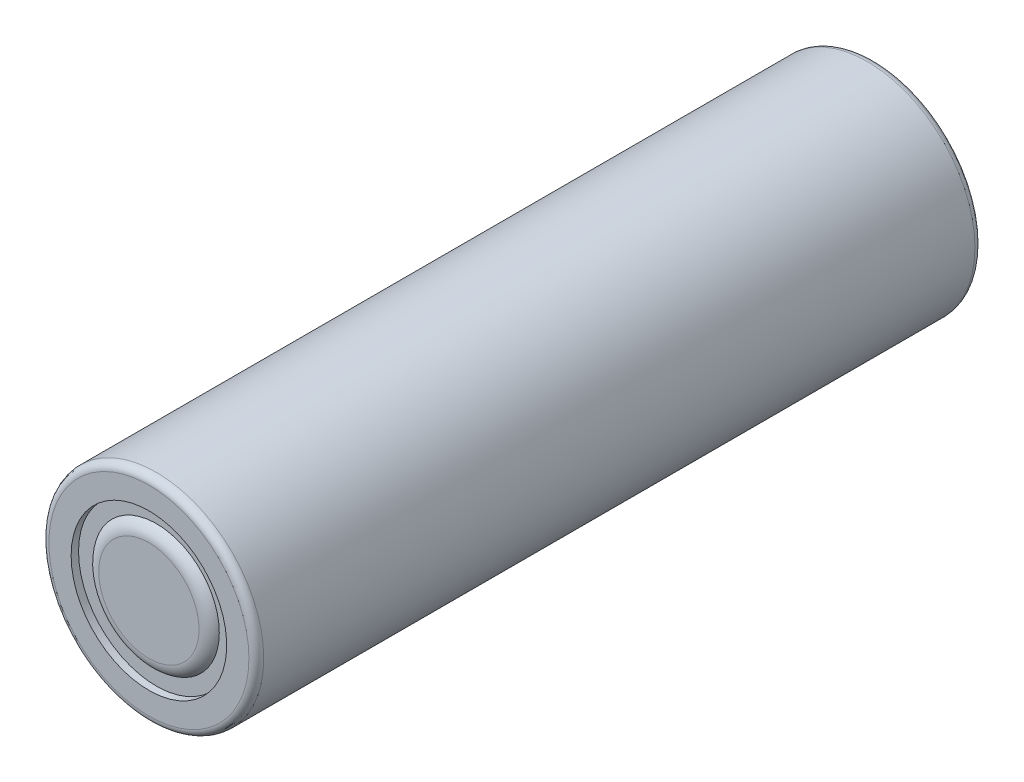
ISO-10303-21;
HEADER;
FILE_DESCRIPTION(('STEP AP214'),'2;1');
FILE_NAME('part.step','',(''),(''),'','','');
FILE_SCHEMA(('AUTOMOTIVE_DESIGN { 1 0 10303 214 1 1 1 1 }'));
ENDSEC;
DATA;
#1=APPLICATION_CONTEXT('core data for automotive mechanical design processes');
#2=APPLICATION_PROTOCOL_DEFINITION('international standard','automotive_design',2000,#1);
#3=PRODUCT_CONTEXT('',#1,'mechanical');
#4=PRODUCT('Part','Part','',(#3));
#5=PRODUCT_RELATED_PRODUCT_CATEGORY('part','',(#4));
#6=PRODUCT_DEFINITION_FORMATION('','',#4);
#7=PRODUCT_DEFINITION_CONTEXT('part definition',#1,'design');
#8=PRODUCT_DEFINITION('design','',#6,#7);
#9=PRODUCT_DEFINITION_SHAPE('','',#8);
#10=(LENGTH_UNIT() NAMED_UNIT(*) SI_UNIT(.MILLI.,.METRE.));
#11=(NAMED_UNIT(*) PLANE_ANGLE_UNIT() SI_UNIT($,.RADIAN.));
#12=(NAMED_UNIT(*) SI_UNIT($,.STERADIAN.) SOLID_ANGLE_UNIT());
#13=UNCERTAINTY_MEASURE_WITH_UNIT(LENGTH_MEASURE(1.E-05),#10,'distance_accuracy_value','');
#14=(GEOMETRIC_REPRESENTATION_CONTEXT(3) GLOBAL_UNCERTAINTY_ASSIGNED_CONTEXT((#13)) GLOBAL_UNIT_ASSIGNED_CONTEXT((#10,
#11,#12)) REPRESENTATION_CONTEXT('',''));
#15=CARTESIAN_POINT('',(0.,0.,0.));
#16=DIRECTION('',(0.,0.,1.));
#17=DIRECTION('',(1.,0.,0.));
#18=AXIS2_PLACEMENT_3D('',#15,#16,#17);
#19=CARTESIAN_POINT('',(0.,0.,-1.5));
#20=DIRECTION('',(0.,0.,1.));
#21=DIRECTION('',(1.,0.,0.));
#22=AXIS2_PLACEMENT_3D('',#19,#20,#21);
#23=PLANE('',#22);
#24=CARTESIAN_POINT('',(0.,0.,-1.5));
#25=DIRECTION('',(0.,0.,1.));
#26=DIRECTION('',(-1.,0.,0.));
#27=AXIS2_PLACEMENT_3D('',#24,#25,#26);
#28=CIRCLE('',#27,2.25);
#29=CARTESIAN_POINT('',(-2.25,0.,-1.5));
#30=VERTEX_POINT('',#29);
#31=EDGE_CURVE('E197',#30,#30,#28,.T.);
#32=ORIENTED_EDGE('',*,*,#31,.F.);
#33=EDGE_LOOP('',(#32));
#34=FACE_BOUND('',#33,.T.);
#35=ADVANCED_FACE('F13',(#34),#23,.F.);
#36=CARTESIAN_POINT('',(0.,0.,-1.));
#37=DIRECTION('',(0.,0.,-1.));
#38=DIRECTION('',(-1.,0.,0.));
#39=AXIS2_PLACEMENT_3D('',#36,#37,#38);
#40=TOROIDAL_SURFACE('',#39,2.25,0.5);
#41=ORIENTED_EDGE('',*,*,#31,.T.);
#42=EDGE_LOOP('',(#41));
#43=FACE_BOUND('',#42,.T.);
#44=CARTESIAN_POINT('',(0.,0.,-1.));
#45=DIRECTION('',(0.,0.,-1.));
#46=DIRECTION('',(-1.,0.,0.));
#47=AXIS2_PLACEMENT_3D('',#44,#45,#46);
#48=CIRCLE('',#47,2.75);
#49=CARTESIAN_POINT('',(-2.75,0.,-1.));
#50=VERTEX_POINT('',#49);
#51=EDGE_CURVE('E189',#50,#50,#48,.F.);
#52=ORIENTED_EDGE('',*,*,#51,.F.);
#53=EDGE_LOOP('',(#52));
#54=FACE_BOUND('',#53,.T.);
#55=ADVANCED_FACE('F204',(#43,#54),#40,.T.);
#56=CARTESIAN_POINT('',(0.,0.,0.));
#57=DIRECTION('',(0.,0.,-1.));
#58=DIRECTION('',(-1.,0.,0.));
#59=AXIS2_PLACEMENT_3D('',#56,#57,#58);
#60=CYLINDRICAL_SURFACE('',#59,2.75);
#61=CARTESIAN_POINT('',(0.,0.,-0.5));
#62=DIRECTION('',(0.,0.,1.));
#63=DIRECTION('',(1.,0.,0.));
#64=AXIS2_PLACEMENT_3D('',#61,#62,#63);
#65=CIRCLE('',#64,2.75);
#66=CARTESIAN_POINT('',(2.75,0.,-0.5));
#67=VERTEX_POINT('',#66);
#68=EDGE_CURVE('E176',#67,#67,#65,.F.);
#69=ORIENTED_EDGE('',*,*,#68,.T.);
#70=EDGE_LOOP('',(#69));
#71=FACE_BOUND('',#70,.T.);
#72=ORIENTED_EDGE('',*,*,#51,.T.);
#73=EDGE_LOOP('',(#72));
#74=FACE_BOUND('',#73,.T.);
#75=ADVANCED_FACE('F182',(#71,#74),#60,.T.);
#76=CARTESIAN_POINT('',(0.,0.,-0.5));
#77=DIRECTION('',(0.,0.,1.));
#78=DIRECTION('',(1.,0.,0.));
#79=AXIS2_PLACEMENT_3D('',#76,#77,#78);
#80=TOROIDAL_SURFACE('',#79,3.25,0.5);
#81=CARTESIAN_POINT('',(0.,0.,0.));
#82=DIRECTION('',(0.,0.,-1.));
#83=DIRECTION('',(-1.,0.,0.));
#84=AXIS2_PLACEMENT_3D('',#81,#82,#83);
#85=CIRCLE('',#84,3.25);
#86=CARTESIAN_POINT('',(-3.25,0.,0.));
#87=VERTEX_POINT('',#86);
#88=EDGE_CURVE('E165',#87,#87,#85,.T.);
#89=ORIENTED_EDGE('',*,*,#88,.T.);
#90=EDGE_LOOP('',(#89));
#91=FACE_BOUND('',#90,.T.);
#92=ORIENTED_EDGE('',*,*,#68,.F.);
#93=EDGE_LOOP('',(#92));
#94=FACE_BOUND('',#93,.T.);
#95=ADVANCED_FACE('F178',(#91,#94),#80,.F.);
#96=CARTESIAN_POINT('',(0.,0.,0.));
#97=DIRECTION('',(0.,0.,1.));
#98=DIRECTION('',(1.,0.,0.));
#99=AXIS2_PLACEMENT_3D('',#96,#97,#98);
#100=PLANE('',#99);
#101=ORIENTED_EDGE('',*,*,#88,.F.);
#102=EDGE_LOOP('',(#101));
#103=FACE_BOUND('',#102,.T.);
#104=CARTESIAN_POINT('',(0.,0.,0.));
#105=DIRECTION('',(0.,0.,1.));
#106=DIRECTION('',(1.,0.,0.));
#107=AXIS2_PLACEMENT_3D('',#104,#105,#106);
#108=CIRCLE('',#107,3.71598300562505);
#109=CARTESIAN_POINT('',(3.71598300562505,0.,0.));
#110=VERTEX_POINT('',#109);
#111=EDGE_CURVE('E17',#110,#110,#108,.T.);
#112=ORIENTED_EDGE('',*,*,#111,.F.);
#113=EDGE_LOOP('',(#112));
#114=FACE_BOUND('',#113,.T.);
#115=ADVANCED_FACE('F153',(#103,#114),#100,.F.);
#116=CARTESIAN_POINT('',(0.,0.,0.));
#117=DIRECTION('',(0.,0.,1.));
#118=DIRECTION('',(1.,0.,0.));
#119=AXIS2_PLACEMENT_3D('',#116,#117,#118);
#120=TOROIDAL_SURFACE('',#119,3.84098300562505,0.125);
#121=CARTESIAN_POINT('',(0.,0.,0.));
#122=DIRECTION('',(0.,0.,1.));
#123=DIRECTION('',(1.,0.,0.));
#124=AXIS2_PLACEMENT_3D('',#121,#122,#123);
#125=CIRCLE('',#124,3.96598300562505);
#126=CARTESIAN_POINT('',(3.96598300562505,0.,0.));
#127=VERTEX_POINT('',#126);
#128=EDGE_CURVE('E229',#127,#127,#125,.F.);
#129=ORIENTED_EDGE('',*,*,#128,.T.);
#130=EDGE_LOOP('',(#129));
#131=FACE_BOUND('',#130,.T.);
#132=ORIENTED_EDGE('',*,*,#111,.T.);
#133=EDGE_LOOP('',(#132));
#134=FACE_BOUND('',#133,.T.);
#135=ADVANCED_FACE('F148',(#131,#134),#120,.T.);
#136=CARTESIAN_POINT('',(0.,0.,49.));
#137=DIRECTION('',(0.,0.,1.));
#138=DIRECTION('',(1.,0.,0.));
#139=AXIS2_PLACEMENT_3D('',#136,#137,#138);
#140=PLANE('',#139);
#141=CARTESIAN_POINT('',(0.,0.,49.));
#142=DIRECTION('',(0.,0.,-1.));
#143=DIRECTION('',(0.,1.,0.));
#144=AXIS2_PLACEMENT_3D('',#141,#142,#143);
#145=CIRCLE('',#144,3.38397459621556);
#146=CARTESIAN_POINT('',(0.,3.38397459621556,49.));
#147=VERTEX_POINT('',#146);
#148=EDGE_CURVE('E132',#147,#147,#145,.T.);
#149=ORIENTED_EDGE('',*,*,#148,.F.);
#150=EDGE_LOOP('',(#149));
#151=FACE_BOUND('',#150,.T.);
#152=ADVANCED_FACE('F138',(#151),#140,.T.);
#153=CARTESIAN_POINT('',(0.,0.,0.));
#154=DIRECTION('',(0.,0.,1.));
#155=DIRECTION('',(1.,0.,0.));
#156=AXIS2_PLACEMENT_3D('',#153,#154,#155);
#157=PLANE('',#156);
#158=ORIENTED_EDGE('',*,*,#128,.F.);
#159=EDGE_LOOP('',(#158));
#160=FACE_BOUND('',#159,.T.);
#161=CARTESIAN_POINT('',(0.,0.,0.));
#162=DIRECTION('',(0.,0.,1.));
#163=DIRECTION('',(-1.,0.,0.));
#164=AXIS2_PLACEMENT_3D('',#161,#162,#163);
#165=CIRCLE('',#164,4.44098300562505);
#166=CARTESIAN_POINT('',(-4.44098300562505,0.,0.));
#167=VERTEX_POINT('',#166);
#168=EDGE_CURVE('E228',#167,#167,#165,.T.);
#169=ORIENTED_EDGE('',*,*,#168,.F.);
#170=EDGE_LOOP('',(#169));
#171=FACE_BOUND('',#170,.T.);
#172=ADVANCED_FACE('F147',(#160,#171),#157,.F.);
#173=CARTESIAN_POINT('',(0.,0.,48.));
#174=DIRECTION('',(0.,0.,1.));
#175=DIRECTION('',(0.,-1.,0.));
#176=AXIS2_PLACEMENT_3D('',#173,#174,#175);
#177=TOROIDAL_SURFACE('',#176,3.38397459621556,1.);
#178=ORIENTED_EDGE('',*,*,#148,.T.);
#179=EDGE_LOOP('',(#178));
#180=FACE_BOUND('',#179,.T.);
#181=CARTESIAN_POINT('',(0.,0.,48.5));
#182=DIRECTION('',(0.,0.,1.));
#183=DIRECTION('',(1.,0.,0.));
#184=AXIS2_PLACEMENT_3D('',#181,#182,#183);
#185=CIRCLE('',#184,4.25);
#186=CARTESIAN_POINT('',(4.25,0.,48.5));
#187=VERTEX_POINT('',#186);
#188=EDGE_CURVE('E101',#187,#187,#185,.T.);
#189=ORIENTED_EDGE('',*,*,#188,.T.);
#190=EDGE_LOOP('',(#189));
#191=FACE_BOUND('',#190,.T.);
#192=ADVANCED_FACE('F112',(#180,#191),#177,.T.);
#193=CARTESIAN_POINT('',(0.,0.,0.5));
#194=DIRECTION('',(0.,0.,-1.));
#195=DIRECTION('',(-1.,0.,0.));
#196=AXIS2_PLACEMENT_3D('',#193,#194,#195);
#197=TOROIDAL_SURFACE('',#196,4.44098300562505,0.5);
#198=ORIENTED_EDGE('',*,*,#168,.T.);
#199=EDGE_LOOP('',(#198));
#200=FACE_BOUND('',#199,.T.);
#201=CARTESIAN_POINT('',(0.,0.,0.166666666666668));
#202=DIRECTION('',(0.,0.,1.));
#203=DIRECTION('',(1.,0.,0.));
#204=AXIS2_PLACEMENT_3D('',#201,#202,#203);
#205=CIRCLE('',#204,4.81366100187502);
#206=CARTESIAN_POINT('',(4.81366100187502,0.,0.166666666666668));
#207=VERTEX_POINT('',#206);
#208=EDGE_CURVE('E97',#207,#207,#205,.F.);
#209=ORIENTED_EDGE('',*,*,#208,.T.);
#210=EDGE_LOOP('',(#209));
#211=FACE_BOUND('',#210,.T.);
#212=ADVANCED_FACE('F108',(#200,#211),#197,.T.);
#213=CARTESIAN_POINT('',(0.,-4.25,48.5));
#214=DIRECTION('',(0.,0.,-1.));
#215=DIRECTION('',(-1.,0.,0.));
#216=AXIS2_PLACEMENT_3D('',#213,#214,#215);
#217=PLANE('',#216);
#218=ORIENTED_EDGE('',*,*,#188,.F.);
#219=EDGE_LOOP('',(#218));
#220=FACE_BOUND('',#219,.T.);
#221=CARTESIAN_POINT('',(0.,0.,48.5));
#222=DIRECTION('',(0.,0.,-1.));
#223=DIRECTION('',(-1.,0.,0.));
#224=AXIS2_PLACEMENT_3D('',#221,#222,#223);
#225=CIRCLE('',#224,5.25);
#226=CARTESIAN_POINT('',(-5.25,0.,48.5));
#227=VERTEX_POINT('',#226);
#228=EDGE_CURVE('E100',#227,#227,#225,.F.);
#229=ORIENTED_EDGE('',*,*,#228,.T.);
#230=EDGE_LOOP('',(#229));
#231=FACE_BOUND('',#230,.T.);
#232=ADVANCED_FACE('F90',(#220,#231),#217,.F.);
#233=CARTESIAN_POINT('',(0.,0.,0.));
#234=DIRECTION('',(0.,0.,1.));
#235=DIRECTION('',(1.,0.,0.));
#236=AXIS2_PLACEMENT_3D('',#233,#234,#235);
#237=TOROIDAL_SURFACE('',#236,5.,0.25);
#238=ORIENTED_EDGE('',*,*,#208,.F.);
#239=EDGE_LOOP('',(#238));
#240=FACE_BOUND('',#239,.T.);
#241=CARTESIAN_POINT('',(0.,0.,0.));
#242=DIRECTION('',(0.,0.,1.));
#243=DIRECTION('',(1.,0.,0.));
#244=AXIS2_PLACEMENT_3D('',#241,#242,#243);
#245=CIRCLE('',#244,5.25);
#246=CARTESIAN_POINT('',(5.25,0.,0.));
#247=VERTEX_POINT('',#246);
#248=EDGE_CURVE('E222',#247,#247,#245,.F.);
#249=ORIENTED_EDGE('',*,*,#248,.T.);
#250=EDGE_LOOP('',(#249));
#251=FACE_BOUND('',#250,.T.);
#252=ADVANCED_FACE('F85',(#240,#251),#237,.F.);
#253=CARTESIAN_POINT('',(0.,0.,48.75));
#254=DIRECTION('',(0.,0.,-1.));
#255=DIRECTION('',(-1.,0.,0.));
#256=AXIS2_PLACEMENT_3D('',#253,#254,#255);
#257=CYLINDRICAL_SURFACE('',#256,5.25);
#258=CARTESIAN_POINT('',(0.,0.,49.));
#259=DIRECTION('',(0.,0.,-1.));
#260=DIRECTION('',(-1.,0.,0.));
#261=AXIS2_PLACEMENT_3D('',#258,#259,#260);
#262=CIRCLE('',#261,5.25);
#263=CARTESIAN_POINT('',(-5.25,0.,49.));
#264=VERTEX_POINT('',#263);
#265=EDGE_CURVE('E214',#264,#264,#262,.T.);
#266=ORIENTED_EDGE('',*,*,#265,.F.);
#267=EDGE_LOOP('',(#266));
#268=FACE_BOUND('',#267,.T.);
#269=ORIENTED_EDGE('',*,*,#228,.F.);
#270=EDGE_LOOP('',(#269));
#271=FACE_BOUND('',#270,.T.);
#272=ADVANCED_FACE('F80',(#268,#271),#257,.F.);
#273=CARTESIAN_POINT('',(0.,0.,0.));
#274=DIRECTION('',(0.,0.,1.));
#275=DIRECTION('',(1.,0.,0.));
#276=AXIS2_PLACEMENT_3D('',#273,#274,#275);
#277=PLANE('',#276);
#278=ORIENTED_EDGE('',*,*,#248,.F.);
#279=EDGE_LOOP('',(#278));
#280=FACE_BOUND('',#279,.T.);
#281=CARTESIAN_POINT('',(0.,0.,0.));
#282=DIRECTION('',(0.,0.,1.));
#283=DIRECTION('',(1.,0.,0.));
#284=AXIS2_PLACEMENT_3D('',#281,#282,#283);
#285=CIRCLE('',#284,6.75);
#286=CARTESIAN_POINT('',(6.75,0.,0.));
#287=VERTEX_POINT('',#286);
#288=EDGE_CURVE('E64',#287,#287,#285,.T.);
#289=ORIENTED_EDGE('',*,*,#288,.F.);
#290=EDGE_LOOP('',(#289));
#291=FACE_BOUND('',#290,.T.);
#292=ADVANCED_FACE('F70',(#280,#291),#277,.F.);
#293=CARTESIAN_POINT('',(0.,0.,49.));
#294=DIRECTION('',(0.,0.,1.));
#295=DIRECTION('',(1.,0.,0.));
#296=AXIS2_PLACEMENT_3D('',#293,#294,#295);
#297=PLANE('',#296);
#298=ORIENTED_EDGE('',*,*,#265,.T.);
#299=EDGE_LOOP('',(#298));
#300=FACE_BOUND('',#299,.T.);
#301=CARTESIAN_POINT('',(0.,0.,49.));
#302=DIRECTION('',(0.,0.,-1.));
#303=DIRECTION('',(1.,0.,0.));
#304=AXIS2_PLACEMENT_3D('',#301,#302,#303);
#305=CIRCLE('',#304,6.75);
#306=CARTESIAN_POINT('',(6.75,0.,49.));
#307=VERTEX_POINT('',#306);
#308=EDGE_CURVE('E26',#307,#307,#305,.T.);
#309=ORIENTED_EDGE('',*,*,#308,.F.);
#310=EDGE_LOOP('',(#309));
#311=FACE_BOUND('',#310,.T.);
#312=ADVANCED_FACE('F79',(#300,#311),#297,.T.);
#313=CARTESIAN_POINT('',(0.,0.,0.5));
#314=DIRECTION('',(0.,0.,-1.));
#315=DIRECTION('',(-1.,0.,0.));
#316=AXIS2_PLACEMENT_3D('',#313,#314,#315);
#317=TOROIDAL_SURFACE('',#316,6.75,0.5);
#318=ORIENTED_EDGE('',*,*,#288,.T.);
#319=EDGE_LOOP('',(#318));
#320=FACE_BOUND('',#319,.T.);
#321=CARTESIAN_POINT('',(0.,0.,0.5));
#322=DIRECTION('',(0.,0.,1.));
#323=DIRECTION('',(1.,0.,0.));
#324=AXIS2_PLACEMENT_3D('',#321,#322,#323);
#325=CIRCLE('',#324,7.25);
#326=CARTESIAN_POINT('',(7.25,0.,0.5));
#327=VERTEX_POINT('',#326);
#328=EDGE_CURVE('E21',#327,#327,#325,.T.);
#329=ORIENTED_EDGE('',*,*,#328,.F.);
#330=EDGE_LOOP('',(#329));
#331=FACE_BOUND('',#330,.T.);
#332=ADVANCED_FACE('F44',(#320,#331),#317,.T.);
#333=CARTESIAN_POINT('',(0.,0.,48.5));
#334=DIRECTION('',(0.,0.,1.));
#335=DIRECTION('',(1.,0.,0.));
#336=AXIS2_PLACEMENT_3D('',#333,#334,#335);
#337=TOROIDAL_SURFACE('',#336,6.75,0.5);
#338=ORIENTED_EDGE('',*,*,#308,.T.);
#339=EDGE_LOOP('',(#338));
#340=FACE_BOUND('',#339,.T.);
#341=CARTESIAN_POINT('',(0.,0.,48.5));
#342=DIRECTION('',(0.,0.,1.));
#343=DIRECTION('',(1.,0.,0.));
#344=AXIS2_PLACEMENT_3D('',#341,#342,#343);
#345=CIRCLE('',#344,7.25);
#346=CARTESIAN_POINT('',(7.25,0.,48.5));
#347=VERTEX_POINT('',#346);
#348=EDGE_CURVE('E9',#347,#347,#345,.F.);
#349=ORIENTED_EDGE('',*,*,#348,.F.);
#350=EDGE_LOOP('',(#349));
#351=FACE_BOUND('',#350,.T.);
#352=ADVANCED_FACE('F38',(#340,#351),#337,.T.);
#353=CARTESIAN_POINT('',(0.,0.,0.));
#354=DIRECTION('',(0.,0.,1.));
#355=DIRECTION('',(1.,0.,0.));
#356=AXIS2_PLACEMENT_3D('',#353,#354,#355);
#357=CYLINDRICAL_SURFACE('',#356,7.25);
#358=ORIENTED_EDGE('',*,*,#348,.T.);
#359=EDGE_LOOP('',(#358));
#360=FACE_BOUND('',#359,.T.);
#361=ORIENTED_EDGE('',*,*,#328,.T.);
#362=EDGE_LOOP('',(#361));
#363=FACE_BOUND('',#362,.T.);
#364=ADVANCED_FACE('F43',(#360,#363),#357,.T.);
#365=CLOSED_SHELL('',(#35,#55,#75,#95,#115,#135,#152,#172,#192,#212,#232,#252,#272,#292,#312,
#332,#352,#364));
#366=MANIFOLD_SOLID_BREP('B1',#365);
#367=ADVANCED_BREP_SHAPE_REPRESENTATION('',(#18,#366),#14);
#368=SHAPE_DEFINITION_REPRESENTATION(#9,#367);
ENDSEC;
END-ISO-10303-21;
